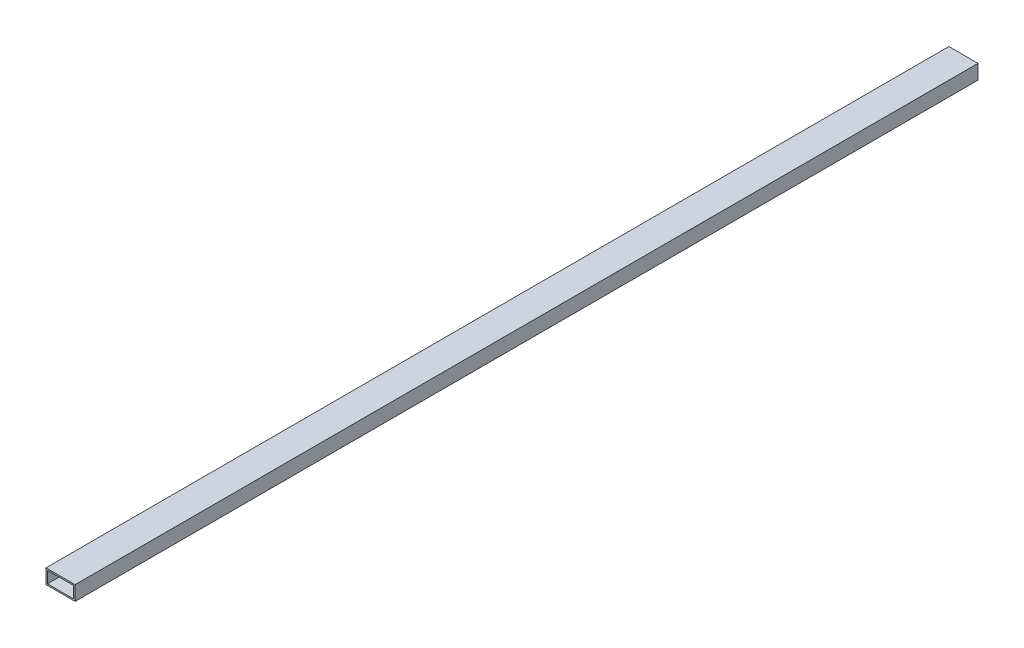
ISO-10303-21;
HEADER;
FILE_DESCRIPTION(('STEP AP214'),'2;1');
FILE_NAME('part.step','',(''),(''),'','','');
FILE_SCHEMA(('AUTOMOTIVE_DESIGN { 1 0 10303 214 1 1 1 1 }'));
ENDSEC;
DATA;
#1=APPLICATION_CONTEXT('core data for automotive mechanical design processes');
#2=APPLICATION_PROTOCOL_DEFINITION('international standard','automotive_design',2000,#1);
#3=PRODUCT_CONTEXT('',#1,'mechanical');
#4=PRODUCT('Part','Part','',(#3));
#5=PRODUCT_RELATED_PRODUCT_CATEGORY('part','',(#4));
#6=PRODUCT_DEFINITION_FORMATION('','',#4);
#7=PRODUCT_DEFINITION_CONTEXT('part definition',#1,'design');
#8=PRODUCT_DEFINITION('design','',#6,#7);
#9=PRODUCT_DEFINITION_SHAPE('','',#8);
#10=(LENGTH_UNIT() NAMED_UNIT(*) SI_UNIT(.MILLI.,.METRE.));
#11=(NAMED_UNIT(*) PLANE_ANGLE_UNIT() SI_UNIT($,.RADIAN.));
#12=(NAMED_UNIT(*) SI_UNIT($,.STERADIAN.) SOLID_ANGLE_UNIT());
#13=UNCERTAINTY_MEASURE_WITH_UNIT(LENGTH_MEASURE(1.E-05),#10,'distance_accuracy_value','');
#14=(GEOMETRIC_REPRESENTATION_CONTEXT(3) GLOBAL_UNCERTAINTY_ASSIGNED_CONTEXT((#13)) GLOBAL_UNIT_ASSIGNED_CONTEXT((#10,
#11,#12)) REPRESENTATION_CONTEXT('',''));
#15=CARTESIAN_POINT('',(0.,0.,0.));
#16=DIRECTION('',(0.,0.,1.));
#17=DIRECTION('',(1.,0.,0.));
#18=AXIS2_PLACEMENT_3D('',#15,#16,#17);
#19=CARTESIAN_POINT('',(0.,0.,620.));
#20=DIRECTION('',(0.,0.,1.));
#21=DIRECTION('',(1.,0.,0.));
#22=AXIS2_PLACEMENT_3D('',#19,#20,#21);
#23=PLANE('',#22);
#24=DIRECTION('',(0.,-1.,0.));
#25=VECTOR('',#24,1.);
#26=CARTESIAN_POINT('',(-10.,-5.,620.));
#27=LINE('',#26,#25);
#28=CARTESIAN_POINT('',(-10.,5.,620.));
#29=VERTEX_POINT('',#28);
#30=CARTESIAN_POINT('',(-10.,-5.,620.));
#31=VERTEX_POINT('',#30);
#32=EDGE_CURVE('E136',#29,#31,#27,.T.);
#33=ORIENTED_EDGE('',*,*,#32,.T.);
#34=DIRECTION('',(1.,0.,0.));
#35=VECTOR('',#34,1.);
#36=CARTESIAN_POINT('',(10.,-5.,620.));
#37=LINE('',#36,#35);
#38=CARTESIAN_POINT('',(10.,-5.,620.));
#39=VERTEX_POINT('',#38);
#40=EDGE_CURVE('E139',#31,#39,#37,.T.);
#41=ORIENTED_EDGE('',*,*,#40,.T.);
#42=DIRECTION('',(0.,1.,0.));
#43=VECTOR('',#42,1.);
#44=CARTESIAN_POINT('',(10.,-5.,620.));
#45=LINE('',#44,#43);
#46=CARTESIAN_POINT('',(10.,5.,620.));
#47=VERTEX_POINT('',#46);
#48=EDGE_CURVE('E142',#39,#47,#45,.T.);
#49=ORIENTED_EDGE('',*,*,#48,.T.);
#50=DIRECTION('',(-1.,0.,0.));
#51=VECTOR('',#50,1.);
#52=CARTESIAN_POINT('',(10.,5.,620.));
#53=LINE('',#52,#51);
#54=EDGE_CURVE('E144',#47,#29,#53,.T.);
#55=ORIENTED_EDGE('',*,*,#54,.T.);
#56=EDGE_LOOP('',(#33,#41,#49,#55));
#57=FACE_BOUND('',#56,.T.);
#58=DIRECTION('',(1.,0.,0.));
#59=VECTOR('',#58,1.);
#60=CARTESIAN_POINT('',(9.00000000000001,-4.,620.));
#61=LINE('',#60,#59);
#62=CARTESIAN_POINT('',(-8.99999999999999,-4.,620.));
#63=VERTEX_POINT('',#62);
#64=CARTESIAN_POINT('',(9.00000000000001,-4.,620.));
#65=VERTEX_POINT('',#64);
#66=EDGE_CURVE('E108',#63,#65,#61,.T.);
#67=ORIENTED_EDGE('',*,*,#66,.F.);
#68=DIRECTION('',(0.,-1.,0.));
#69=VECTOR('',#68,1.);
#70=CARTESIAN_POINT('',(-8.99999999999999,-4.,620.));
#71=LINE('',#70,#69);
#72=CARTESIAN_POINT('',(-8.99999999999999,4.,620.));
#73=VERTEX_POINT('',#72);
#74=EDGE_CURVE('E100',#73,#63,#71,.T.);
#75=ORIENTED_EDGE('',*,*,#74,.F.);
#76=DIRECTION('',(-1.,0.,0.));
#77=VECTOR('',#76,1.);
#78=CARTESIAN_POINT('',(9.00000000000001,4.,620.));
#79=LINE('',#78,#77);
#80=CARTESIAN_POINT('',(9.00000000000001,4.,620.));
#81=VERTEX_POINT('',#80);
#82=EDGE_CURVE('E122',#81,#73,#79,.T.);
#83=ORIENTED_EDGE('',*,*,#82,.F.);
#84=DIRECTION('',(0.,1.,0.));
#85=VECTOR('',#84,1.);
#86=CARTESIAN_POINT('',(9.00000000000001,-4.,620.));
#87=LINE('',#86,#85);
#88=EDGE_CURVE('E120',#65,#81,#87,.T.);
#89=ORIENTED_EDGE('',*,*,#88,.F.);
#90=EDGE_LOOP('',(#67,#75,#83,#89));
#91=FACE_BOUND('',#90,.T.);
#92=ADVANCED_FACE('F35',(#57,#91),#23,.T.);
#93=CARTESIAN_POINT('',(0.,0.,0.));
#94=DIRECTION('',(0.,0.,1.));
#95=DIRECTION('',(1.,0.,0.));
#96=AXIS2_PLACEMENT_3D('',#93,#94,#95);
#97=PLANE('',#96);
#98=DIRECTION('',(0.,-1.,0.));
#99=VECTOR('',#98,1.);
#100=CARTESIAN_POINT('',(-10.,-5.,0.));
#101=LINE('',#100,#99);
#102=CARTESIAN_POINT('',(-10.,5.,0.));
#103=VERTEX_POINT('',#102);
#104=CARTESIAN_POINT('',(-10.,-5.,0.));
#105=VERTEX_POINT('',#104);
#106=EDGE_CURVE('E116',#103,#105,#101,.T.);
#107=ORIENTED_EDGE('',*,*,#106,.F.);
#108=DIRECTION('',(-1.,0.,0.));
#109=VECTOR('',#108,1.);
#110=CARTESIAN_POINT('',(10.,5.,0.));
#111=LINE('',#110,#109);
#112=CARTESIAN_POINT('',(10.,5.,0.));
#113=VERTEX_POINT('',#112);
#114=EDGE_CURVE('E140',#113,#103,#111,.T.);
#115=ORIENTED_EDGE('',*,*,#114,.F.);
#116=DIRECTION('',(0.,1.,0.));
#117=VECTOR('',#116,1.);
#118=CARTESIAN_POINT('',(10.,-5.,0.));
#119=LINE('',#118,#117);
#120=CARTESIAN_POINT('',(10.,-5.,0.));
#121=VERTEX_POINT('',#120);
#122=EDGE_CURVE('E151',#121,#113,#119,.T.);
#123=ORIENTED_EDGE('',*,*,#122,.F.);
#124=DIRECTION('',(1.,0.,0.));
#125=VECTOR('',#124,1.);
#126=CARTESIAN_POINT('',(10.,-5.,0.));
#127=LINE('',#126,#125);
#128=EDGE_CURVE('E149',#105,#121,#127,.T.);
#129=ORIENTED_EDGE('',*,*,#128,.F.);
#130=EDGE_LOOP('',(#107,#115,#123,#129));
#131=FACE_BOUND('',#130,.T.);
#132=DIRECTION('',(0.,-1.,0.));
#133=VECTOR('',#132,1.);
#134=CARTESIAN_POINT('',(-8.99999999999999,-4.,0.));
#135=LINE('',#134,#133);
#136=CARTESIAN_POINT('',(-8.99999999999999,4.,0.));
#137=VERTEX_POINT('',#136);
#138=CARTESIAN_POINT('',(-8.99999999999999,-4.,0.));
#139=VERTEX_POINT('',#138);
#140=EDGE_CURVE('E58',#137,#139,#135,.T.);
#141=ORIENTED_EDGE('',*,*,#140,.T.);
#142=DIRECTION('',(1.,0.,0.));
#143=VECTOR('',#142,1.);
#144=CARTESIAN_POINT('',(9.00000000000001,-4.,0.));
#145=LINE('',#144,#143);
#146=CARTESIAN_POINT('',(9.00000000000001,-4.,0.));
#147=VERTEX_POINT('',#146);
#148=EDGE_CURVE('E115',#139,#147,#145,.T.);
#149=ORIENTED_EDGE('',*,*,#148,.T.);
#150=DIRECTION('',(0.,1.,0.));
#151=VECTOR('',#150,1.);
#152=CARTESIAN_POINT('',(9.00000000000001,-4.,0.));
#153=LINE('',#152,#151);
#154=CARTESIAN_POINT('',(9.00000000000001,4.,0.));
#155=VERTEX_POINT('',#154);
#156=EDGE_CURVE('E128',#147,#155,#153,.T.);
#157=ORIENTED_EDGE('',*,*,#156,.T.);
#158=DIRECTION('',(-1.,0.,0.));
#159=VECTOR('',#158,1.);
#160=CARTESIAN_POINT('',(9.00000000000001,4.,0.));
#161=LINE('',#160,#159);
#162=EDGE_CURVE('E109',#155,#137,#161,.T.);
#163=ORIENTED_EDGE('',*,*,#162,.T.);
#164=EDGE_LOOP('',(#141,#149,#157,#163));
#165=FACE_BOUND('',#164,.T.);
#166=ADVANCED_FACE('F169',(#131,#165),#97,.F.);
#167=CARTESIAN_POINT('',(-10.,-5.,620.));
#168=DIRECTION('',(1.,0.,0.));
#169=DIRECTION('',(0.,0.,-1.));
#170=AXIS2_PLACEMENT_3D('',#167,#168,#169);
#171=PLANE('',#170);
#172=ORIENTED_EDGE('',*,*,#106,.T.);
#173=DIRECTION('',(0.,0.,-1.));
#174=VECTOR('',#173,1.);
#175=CARTESIAN_POINT('',(-10.,-5.,620.));
#176=LINE('',#175,#174);
#177=EDGE_CURVE('E11',#31,#105,#176,.T.);
#178=ORIENTED_EDGE('',*,*,#177,.F.);
#179=ORIENTED_EDGE('',*,*,#32,.F.);
#180=DIRECTION('',(0.,0.,-1.));
#181=VECTOR('',#180,1.);
#182=CARTESIAN_POINT('',(-10.,5.,620.));
#183=LINE('',#182,#181);
#184=EDGE_CURVE('E146',#29,#103,#183,.T.);
#185=ORIENTED_EDGE('',*,*,#184,.T.);
#186=EDGE_LOOP('',(#172,#178,#179,#185));
#187=FACE_BOUND('',#186,.T.);
#188=ADVANCED_FACE('F37',(#187),#171,.F.);
#189=CARTESIAN_POINT('',(10.,-5.,620.));
#190=DIRECTION('',(0.,1.,0.));
#191=DIRECTION('',(-1.,0.,0.));
#192=AXIS2_PLACEMENT_3D('',#189,#190,#191);
#193=PLANE('',#192);
#194=ORIENTED_EDGE('',*,*,#128,.T.);
#195=DIRECTION('',(0.,0.,-1.));
#196=VECTOR('',#195,1.);
#197=CARTESIAN_POINT('',(10.,-5.,620.));
#198=LINE('',#197,#196);
#199=EDGE_CURVE('E43',#39,#121,#198,.T.);
#200=ORIENTED_EDGE('',*,*,#199,.F.);
#201=ORIENTED_EDGE('',*,*,#40,.F.);
#202=ORIENTED_EDGE('',*,*,#177,.T.);
#203=EDGE_LOOP('',(#194,#200,#201,#202));
#204=FACE_BOUND('',#203,.T.);
#205=ADVANCED_FACE('F179',(#204),#193,.F.);
#206=CARTESIAN_POINT('',(10.,-5.,620.));
#207=DIRECTION('',(-1.,0.,0.));
#208=DIRECTION('',(0.,0.,1.));
#209=AXIS2_PLACEMENT_3D('',#206,#207,#208);
#210=PLANE('',#209);
#211=ORIENTED_EDGE('',*,*,#122,.T.);
#212=DIRECTION('',(0.,0.,-1.));
#213=VECTOR('',#212,1.);
#214=CARTESIAN_POINT('',(10.,5.,620.));
#215=LINE('',#214,#213);
#216=EDGE_CURVE('E156',#47,#113,#215,.T.);
#217=ORIENTED_EDGE('',*,*,#216,.F.);
#218=ORIENTED_EDGE('',*,*,#48,.F.);
#219=ORIENTED_EDGE('',*,*,#199,.T.);
#220=EDGE_LOOP('',(#211,#217,#218,#219));
#221=FACE_BOUND('',#220,.T.);
#222=ADVANCED_FACE('F163',(#221),#210,.F.);
#223=CARTESIAN_POINT('',(10.,5.,620.));
#224=DIRECTION('',(0.,-1.,0.));
#225=DIRECTION('',(0.,0.,-1.));
#226=AXIS2_PLACEMENT_3D('',#223,#224,#225);
#227=PLANE('',#226);
#228=ORIENTED_EDGE('',*,*,#114,.T.);
#229=ORIENTED_EDGE('',*,*,#184,.F.);
#230=ORIENTED_EDGE('',*,*,#54,.F.);
#231=ORIENTED_EDGE('',*,*,#216,.T.);
#232=EDGE_LOOP('',(#228,#229,#230,#231));
#233=FACE_BOUND('',#232,.T.);
#234=ADVANCED_FACE('F173',(#233),#227,.F.);
#235=CARTESIAN_POINT('',(-8.99999999999999,-4.,620.));
#236=DIRECTION('',(1.,0.,0.));
#237=DIRECTION('',(0.,0.,-1.));
#238=AXIS2_PLACEMENT_3D('',#235,#236,#237);
#239=PLANE('',#238);
#240=ORIENTED_EDGE('',*,*,#140,.F.);
#241=DIRECTION('',(0.,0.,-1.));
#242=VECTOR('',#241,1.);
#243=CARTESIAN_POINT('',(-8.99999999999999,4.,620.));
#244=LINE('',#243,#242);
#245=EDGE_CURVE('E104',#73,#137,#244,.T.);
#246=ORIENTED_EDGE('',*,*,#245,.F.);
#247=ORIENTED_EDGE('',*,*,#74,.T.);
#248=DIRECTION('',(0.,0.,-1.));
#249=VECTOR('',#248,1.);
#250=CARTESIAN_POINT('',(-8.99999999999999,-4.,620.));
#251=LINE('',#250,#249);
#252=EDGE_CURVE('E103',#63,#139,#251,.T.);
#253=ORIENTED_EDGE('',*,*,#252,.T.);
#254=EDGE_LOOP('',(#240,#246,#247,#253));
#255=FACE_BOUND('',#254,.T.);
#256=ADVANCED_FACE('F102',(#255),#239,.T.);
#257=CARTESIAN_POINT('',(9.00000000000001,-4.,620.));
#258=DIRECTION('',(0.,1.,0.));
#259=DIRECTION('',(-1.,0.,0.));
#260=AXIS2_PLACEMENT_3D('',#257,#258,#259);
#261=PLANE('',#260);
#262=ORIENTED_EDGE('',*,*,#148,.F.);
#263=ORIENTED_EDGE('',*,*,#252,.F.);
#264=ORIENTED_EDGE('',*,*,#66,.T.);
#265=DIRECTION('',(0.,0.,-1.));
#266=VECTOR('',#265,1.);
#267=CARTESIAN_POINT('',(9.00000000000001,-4.,620.));
#268=LINE('',#267,#266);
#269=EDGE_CURVE('E117',#65,#147,#268,.T.);
#270=ORIENTED_EDGE('',*,*,#269,.T.);
#271=EDGE_LOOP('',(#262,#263,#264,#270));
#272=FACE_BOUND('',#271,.T.);
#273=ADVANCED_FACE('F112',(#272),#261,.T.);
#274=CARTESIAN_POINT('',(9.00000000000001,-4.,620.));
#275=DIRECTION('',(-1.,0.,0.));
#276=DIRECTION('',(0.,0.,1.));
#277=AXIS2_PLACEMENT_3D('',#274,#275,#276);
#278=PLANE('',#277);
#279=ORIENTED_EDGE('',*,*,#156,.F.);
#280=ORIENTED_EDGE('',*,*,#269,.F.);
#281=ORIENTED_EDGE('',*,*,#88,.T.);
#282=DIRECTION('',(0.,0.,-1.));
#283=VECTOR('',#282,1.);
#284=CARTESIAN_POINT('',(9.00000000000001,4.,620.));
#285=LINE('',#284,#283);
#286=EDGE_CURVE('E50',#81,#155,#285,.T.);
#287=ORIENTED_EDGE('',*,*,#286,.T.);
#288=EDGE_LOOP('',(#279,#280,#281,#287));
#289=FACE_BOUND('',#288,.T.);
#290=ADVANCED_FACE('F202',(#289),#278,.T.);
#291=CARTESIAN_POINT('',(9.00000000000001,4.,620.));
#292=DIRECTION('',(0.,-1.,0.));
#293=DIRECTION('',(1.,0.,0.));
#294=AXIS2_PLACEMENT_3D('',#291,#292,#293);
#295=PLANE('',#294);
#296=ORIENTED_EDGE('',*,*,#162,.F.);
#297=ORIENTED_EDGE('',*,*,#286,.F.);
#298=ORIENTED_EDGE('',*,*,#82,.T.);
#299=ORIENTED_EDGE('',*,*,#245,.T.);
#300=EDGE_LOOP('',(#296,#297,#298,#299));
#301=FACE_BOUND('',#300,.T.);
#302=ADVANCED_FACE('F206',(#301),#295,.T.);
#303=CLOSED_SHELL('',(#92,#166,#188,#205,#222,#234,#256,#273,#290,#302));
#304=MANIFOLD_SOLID_BREP('B2',#303);
#305=ADVANCED_BREP_SHAPE_REPRESENTATION('',(#18,#304),#14);
#306=SHAPE_DEFINITION_REPRESENTATION(#9,#305);
ENDSEC;
END-ISO-10303-21;
